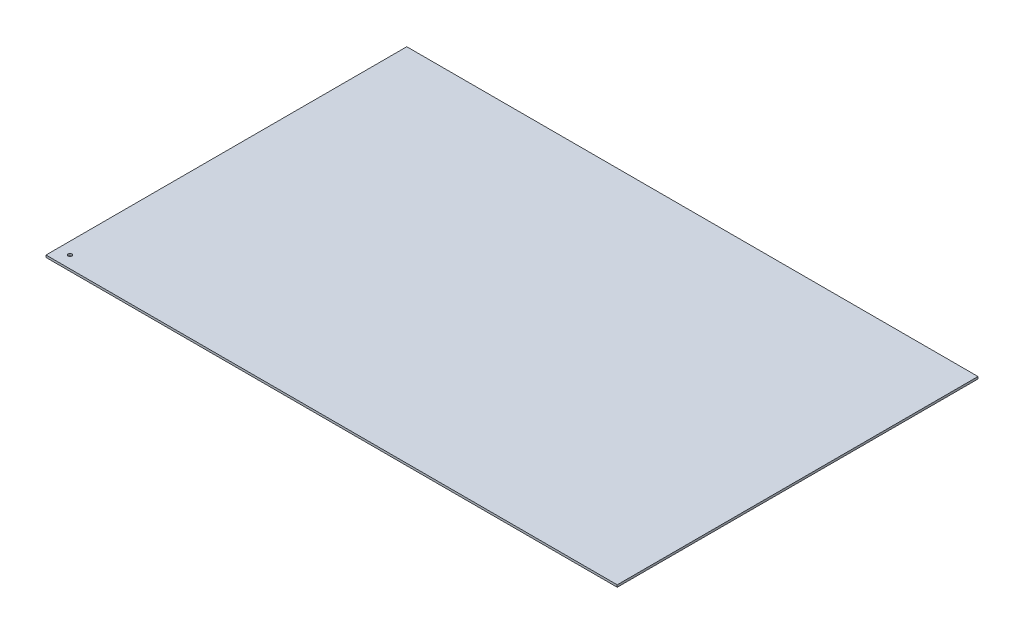
ISO-10303-21;
HEADER;
FILE_DESCRIPTION(('STEP AP214'),'2;1');
FILE_NAME('part.step','',(''),(''),'','','');
FILE_SCHEMA(('AUTOMOTIVE_DESIGN { 1 0 10303 214 1 1 1 1 }'));
ENDSEC;
DATA;
#1=APPLICATION_CONTEXT('core data for automotive mechanical design processes');
#2=APPLICATION_PROTOCOL_DEFINITION('international standard','automotive_design',2000,#1);
#3=PRODUCT_CONTEXT('',#1,'mechanical');
#4=PRODUCT('Part','Part','',(#3));
#5=PRODUCT_RELATED_PRODUCT_CATEGORY('part','',(#4));
#6=PRODUCT_DEFINITION_FORMATION('','',#4);
#7=PRODUCT_DEFINITION_CONTEXT('part definition',#1,'design');
#8=PRODUCT_DEFINITION('design','',#6,#7);
#9=PRODUCT_DEFINITION_SHAPE('','',#8);
#10=(LENGTH_UNIT() NAMED_UNIT(*) SI_UNIT(.MILLI.,.METRE.));
#11=(NAMED_UNIT(*) PLANE_ANGLE_UNIT() SI_UNIT($,.RADIAN.));
#12=(NAMED_UNIT(*) SI_UNIT($,.STERADIAN.) SOLID_ANGLE_UNIT());
#13=UNCERTAINTY_MEASURE_WITH_UNIT(LENGTH_MEASURE(1.E-05),#10,'distance_accuracy_value','');
#14=(GEOMETRIC_REPRESENTATION_CONTEXT(3) GLOBAL_UNCERTAINTY_ASSIGNED_CONTEXT((#13)) GLOBAL_UNIT_ASSIGNED_CONTEXT((#10,
#11,#12)) REPRESENTATION_CONTEXT('',''));
#15=CARTESIAN_POINT('',(0.,0.,0.));
#16=DIRECTION('',(0.,0.,1.));
#17=DIRECTION('',(1.,0.,0.));
#18=AXIS2_PLACEMENT_3D('',#15,#16,#17);
#19=CARTESIAN_POINT('',(0.,2.286,0.));
#20=DIRECTION('',(-1.,0.,0.));
#21=DIRECTION('',(0.,0.,1.));
#22=AXIS2_PLACEMENT_3D('',#19,#20,#21);
#23=PLANE('',#22);
#24=DIRECTION('',(0.,0.,-1.));
#25=VECTOR('',#24,1.);
#26=CARTESIAN_POINT('',(0.,0.,0.));
#27=LINE('',#26,#25);
#28=CARTESIAN_POINT('',(0.,0.,0.));
#29=VERTEX_POINT('',#28);
#30=CARTESIAN_POINT('',(0.,0.,-381.));
#31=VERTEX_POINT('',#30);
#32=EDGE_CURVE('E115',#29,#31,#27,.T.);
#33=ORIENTED_EDGE('',*,*,#32,.F.);
#34=DIRECTION('',(0.,-1.,0.));
#35=VECTOR('',#34,1.);
#36=CARTESIAN_POINT('',(0.,2.286,0.));
#37=LINE('',#36,#35);
#38=CARTESIAN_POINT('',(0.,2.286,0.));
#39=VERTEX_POINT('',#38);
#40=EDGE_CURVE('E11',#39,#29,#37,.T.);
#41=ORIENTED_EDGE('',*,*,#40,.F.);
#42=DIRECTION('',(0.,0.,-1.));
#43=VECTOR('',#42,1.);
#44=CARTESIAN_POINT('',(0.,2.286,0.));
#45=LINE('',#44,#43);
#46=CARTESIAN_POINT('',(0.,2.286,-381.));
#47=VERTEX_POINT('',#46);
#48=EDGE_CURVE('E106',#39,#47,#45,.T.);
#49=ORIENTED_EDGE('',*,*,#48,.T.);
#50=DIRECTION('',(0.,-1.,0.));
#51=VECTOR('',#50,1.);
#52=CARTESIAN_POINT('',(0.,2.286,-381.));
#53=LINE('',#52,#51);
#54=EDGE_CURVE('E88',#47,#31,#53,.T.);
#55=ORIENTED_EDGE('',*,*,#54,.T.);
#56=EDGE_LOOP('',(#33,#41,#49,#55));
#57=FACE_BOUND('',#56,.T.);
#58=ADVANCED_FACE('F42',(#57),#23,.T.);
#59=CARTESIAN_POINT('',(603.25,2.286,0.));
#60=DIRECTION('',(0.,0.,1.));
#61=DIRECTION('',(1.,0.,0.));
#62=AXIS2_PLACEMENT_3D('',#59,#60,#61);
#63=PLANE('',#62);
#64=DIRECTION('',(-1.,0.,0.));
#65=VECTOR('',#64,1.);
#66=CARTESIAN_POINT('',(603.25,0.,0.));
#67=LINE('',#66,#65);
#68=CARTESIAN_POINT('',(603.25,0.,0.));
#69=VERTEX_POINT('',#68);
#70=EDGE_CURVE('E109',#69,#29,#67,.T.);
#71=ORIENTED_EDGE('',*,*,#70,.F.);
#72=DIRECTION('',(0.,-1.,0.));
#73=VECTOR('',#72,1.);
#74=CARTESIAN_POINT('',(603.25,2.286,0.));
#75=LINE('',#74,#73);
#76=CARTESIAN_POINT('',(603.25,2.286,0.));
#77=VERTEX_POINT('',#76);
#78=EDGE_CURVE('E52',#77,#69,#75,.T.);
#79=ORIENTED_EDGE('',*,*,#78,.F.);
#80=DIRECTION('',(-1.,0.,0.));
#81=VECTOR('',#80,1.);
#82=CARTESIAN_POINT('',(603.25,2.286,0.));
#83=LINE('',#82,#81);
#84=EDGE_CURVE('E102',#77,#39,#83,.T.);
#85=ORIENTED_EDGE('',*,*,#84,.T.);
#86=ORIENTED_EDGE('',*,*,#40,.T.);
#87=EDGE_LOOP('',(#71,#79,#85,#86));
#88=FACE_BOUND('',#87,.T.);
#89=ADVANCED_FACE('F127',(#88),#63,.T.);
#90=CARTESIAN_POINT('',(603.25,2.286,-381.));
#91=DIRECTION('',(1.,0.,0.));
#92=DIRECTION('',(0.,0.,-1.));
#93=AXIS2_PLACEMENT_3D('',#90,#91,#92);
#94=PLANE('',#93);
#95=DIRECTION('',(0.,0.,1.));
#96=VECTOR('',#95,1.);
#97=CARTESIAN_POINT('',(603.25,0.,-381.));
#98=LINE('',#97,#96);
#99=CARTESIAN_POINT('',(603.25,0.,-381.));
#100=VERTEX_POINT('',#99);
#101=EDGE_CURVE('E96',#100,#69,#98,.T.);
#102=ORIENTED_EDGE('',*,*,#101,.F.);
#103=DIRECTION('',(0.,-1.,0.));
#104=VECTOR('',#103,1.);
#105=CARTESIAN_POINT('',(603.25,2.286,-381.));
#106=LINE('',#105,#104);
#107=CARTESIAN_POINT('',(603.25,2.286,-381.));
#108=VERTEX_POINT('',#107);
#109=EDGE_CURVE('E91',#108,#100,#106,.T.);
#110=ORIENTED_EDGE('',*,*,#109,.F.);
#111=DIRECTION('',(0.,0.,1.));
#112=VECTOR('',#111,1.);
#113=CARTESIAN_POINT('',(603.25,2.286,-381.));
#114=LINE('',#113,#112);
#115=EDGE_CURVE('E94',#108,#77,#114,.T.);
#116=ORIENTED_EDGE('',*,*,#115,.T.);
#117=ORIENTED_EDGE('',*,*,#78,.T.);
#118=EDGE_LOOP('',(#102,#110,#116,#117));
#119=FACE_BOUND('',#118,.T.);
#120=ADVANCED_FACE('F93',(#119),#94,.T.);
#121=CARTESIAN_POINT('',(0.,2.286,-381.));
#122=DIRECTION('',(0.,0.,-1.));
#123=DIRECTION('',(-1.,0.,0.));
#124=AXIS2_PLACEMENT_3D('',#121,#122,#123);
#125=PLANE('',#124);
#126=DIRECTION('',(1.,0.,0.));
#127=VECTOR('',#126,1.);
#128=CARTESIAN_POINT('',(0.,0.,-381.));
#129=LINE('',#128,#127);
#130=EDGE_CURVE('E119',#31,#100,#129,.T.);
#131=ORIENTED_EDGE('',*,*,#130,.F.);
#132=ORIENTED_EDGE('',*,*,#54,.F.);
#133=DIRECTION('',(1.,0.,0.));
#134=VECTOR('',#133,1.);
#135=CARTESIAN_POINT('',(0.,2.286,-381.));
#136=LINE('',#135,#134);
#137=EDGE_CURVE('E101',#47,#108,#136,.T.);
#138=ORIENTED_EDGE('',*,*,#137,.T.);
#139=ORIENTED_EDGE('',*,*,#109,.T.);
#140=EDGE_LOOP('',(#131,#132,#138,#139));
#141=FACE_BOUND('',#140,.T.);
#142=ADVANCED_FACE('F105',(#141),#125,.T.);
#143=CARTESIAN_POINT('',(0.,2.286,0.));
#144=DIRECTION('',(0.,-1.,0.));
#145=DIRECTION('',(0.,0.,-1.));
#146=AXIS2_PLACEMENT_3D('',#143,#144,#145);
#147=PLANE('',#146);
#148=CARTESIAN_POINT('',(12.7,2.286,-12.7));
#149=DIRECTION('',(0.,1.,0.));
#150=DIRECTION('',(0.,0.,1.));
#151=AXIS2_PLACEMENT_3D('',#148,#149,#150);
#152=CIRCLE('',#151,2.032);
#153=CARTESIAN_POINT('',(12.7,2.286,-10.668));
#154=VERTEX_POINT('',#153);
#155=EDGE_CURVE('E157',#154,#154,#152,.T.);
#156=ORIENTED_EDGE('',*,*,#155,.F.);
#157=EDGE_LOOP('',(#156));
#158=FACE_BOUND('',#157,.T.);
#159=ORIENTED_EDGE('',*,*,#48,.F.);
#160=ORIENTED_EDGE('',*,*,#84,.F.);
#161=ORIENTED_EDGE('',*,*,#115,.F.);
#162=ORIENTED_EDGE('',*,*,#137,.F.);
#163=EDGE_LOOP('',(#159,#160,#161,#162));
#164=FACE_BOUND('',#163,.T.);
#165=ADVANCED_FACE('F100',(#158,#164),#147,.F.);
#166=CARTESIAN_POINT('',(0.,0.,0.));
#167=DIRECTION('',(0.,-1.,0.));
#168=DIRECTION('',(0.,0.,-1.));
#169=AXIS2_PLACEMENT_3D('',#166,#167,#168);
#170=PLANE('',#169);
#171=CARTESIAN_POINT('',(12.7,0.,-12.7));
#172=DIRECTION('',(0.,-1.,0.));
#173=DIRECTION('',(0.,0.,-1.));
#174=AXIS2_PLACEMENT_3D('',#171,#172,#173);
#175=CIRCLE('',#174,2.032);
#176=CARTESIAN_POINT('',(12.7,0.,-14.732));
#177=VERTEX_POINT('',#176);
#178=EDGE_CURVE('E45',#177,#177,#175,.T.);
#179=ORIENTED_EDGE('',*,*,#178,.F.);
#180=EDGE_LOOP('',(#179));
#181=FACE_BOUND('',#180,.T.);
#182=ORIENTED_EDGE('',*,*,#32,.T.);
#183=ORIENTED_EDGE('',*,*,#130,.T.);
#184=ORIENTED_EDGE('',*,*,#101,.T.);
#185=ORIENTED_EDGE('',*,*,#70,.T.);
#186=EDGE_LOOP('',(#182,#183,#184,#185));
#187=FACE_BOUND('',#186,.T.);
#188=ADVANCED_FACE('F126',(#181,#187),#170,.T.);
#189=CARTESIAN_POINT('',(12.7,-20.574,-12.7));
#190=DIRECTION('',(0.,1.,0.));
#191=DIRECTION('',(0.,0.,1.));
#192=AXIS2_PLACEMENT_3D('',#189,#190,#191);
#193=CYLINDRICAL_SURFACE('',#192,2.032);
#194=ORIENTED_EDGE('',*,*,#178,.T.);
#195=EDGE_LOOP('',(#194));
#196=FACE_BOUND('',#195,.T.);
#197=ORIENTED_EDGE('',*,*,#155,.T.);
#198=EDGE_LOOP('',(#197));
#199=FACE_BOUND('',#198,.T.);
#200=ADVANCED_FACE('F145',(#196,#199),#193,.F.);
#201=CLOSED_SHELL('',(#58,#89,#120,#142,#165,#188,#200));
#202=MANIFOLD_SOLID_BREP('B2',#201);
#203=ADVANCED_BREP_SHAPE_REPRESENTATION('',(#18,#202),#14);
#204=SHAPE_DEFINITION_REPRESENTATION(#9,#203);
ENDSEC;
END-ISO-10303-21;
